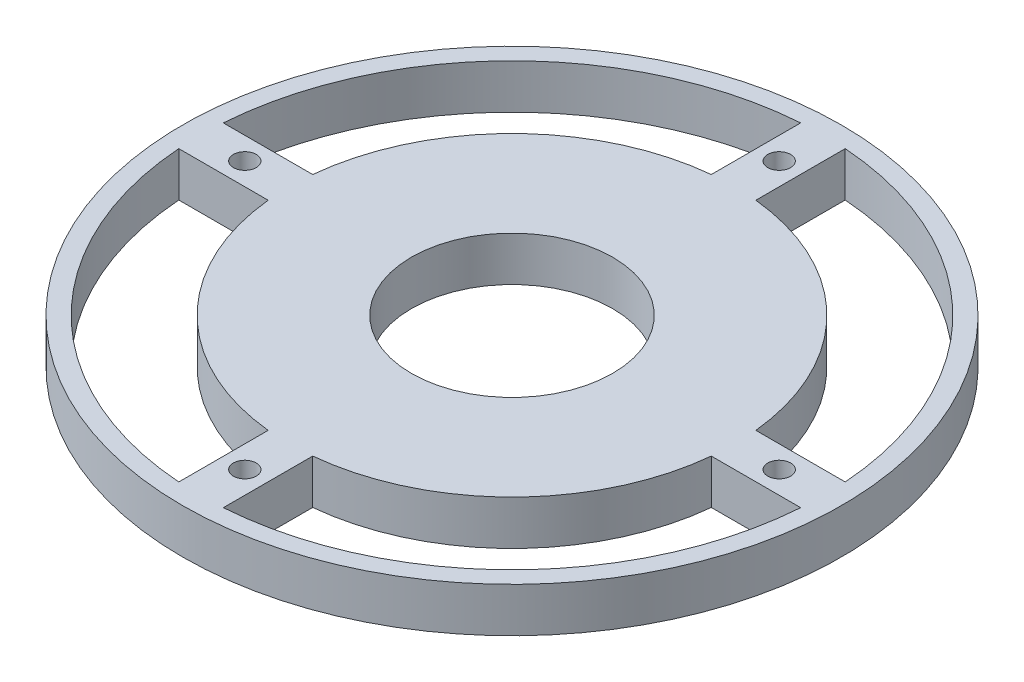
ISO-10303-21;
HEADER;
FILE_DESCRIPTION(('STEP AP214'),'2;1');
FILE_NAME('part.step','',(''),(''),'','','');
FILE_SCHEMA(('AUTOMOTIVE_DESIGN { 1 0 10303 214 1 1 1 1 }'));
ENDSEC;
DATA;
#1=APPLICATION_CONTEXT('core data for automotive mechanical design processes');
#2=APPLICATION_PROTOCOL_DEFINITION('international standard','automotive_design',2000,#1);
#3=PRODUCT_CONTEXT('',#1,'mechanical');
#4=PRODUCT('Part','Part','',(#3));
#5=PRODUCT_RELATED_PRODUCT_CATEGORY('part','',(#4));
#6=PRODUCT_DEFINITION_FORMATION('','',#4);
#7=PRODUCT_DEFINITION_CONTEXT('part definition',#1,'design');
#8=PRODUCT_DEFINITION('design','',#6,#7);
#9=PRODUCT_DEFINITION_SHAPE('','',#8);
#10=(LENGTH_UNIT() NAMED_UNIT(*) SI_UNIT(.MILLI.,.METRE.));
#11=(NAMED_UNIT(*) PLANE_ANGLE_UNIT() SI_UNIT($,.RADIAN.));
#12=(NAMED_UNIT(*) SI_UNIT($,.STERADIAN.) SOLID_ANGLE_UNIT());
#13=UNCERTAINTY_MEASURE_WITH_UNIT(LENGTH_MEASURE(1.E-05),#10,'distance_accuracy_value','');
#14=(GEOMETRIC_REPRESENTATION_CONTEXT(3) GLOBAL_UNCERTAINTY_ASSIGNED_CONTEXT((#13)) GLOBAL_UNIT_ASSIGNED_CONTEXT((#10,
#11,#12)) REPRESENTATION_CONTEXT('',''));
#15=CARTESIAN_POINT('',(0.,0.,0.));
#16=DIRECTION('',(0.,0.,1.));
#17=DIRECTION('',(1.,0.,0.));
#18=AXIS2_PLACEMENT_3D('',#15,#16,#17);
#19=CARTESIAN_POINT('',(0.,6.35,0.));
#20=DIRECTION('',(0.,1.,0.));
#21=DIRECTION('',(0.,0.,1.));
#22=AXIS2_PLACEMENT_3D('',#19,#20,#21);
#23=PLANE('',#22);
#24=CARTESIAN_POINT('',(38.1,6.35,-3.9907631702977E-13));
#25=DIRECTION('',(0.,1.,0.));
#26=DIRECTION('',(0.,0.,1.));
#27=AXIS2_PLACEMENT_3D('',#24,#25,#26);
#28=CIRCLE('',#27,1.63194999999999);
#29=CARTESIAN_POINT('',(38.1,6.35,1.63194999999959));
#30=VERTEX_POINT('',#29);
#31=EDGE_CURVE('E307',#30,#30,#28,.T.);
#32=ORIENTED_EDGE('',*,*,#31,.F.);
#33=EDGE_LOOP('',(#32));
#34=FACE_BOUND('',#33,.T.);
#35=CARTESIAN_POINT('',(0.,6.35,38.1));
#36=DIRECTION('',(0.,1.,0.));
#37=DIRECTION('',(0.,0.,1.));
#38=AXIS2_PLACEMENT_3D('',#35,#36,#37);
#39=CIRCLE('',#38,1.63194999999999);
#40=CARTESIAN_POINT('',(0.,6.35,39.73195));
#41=VERTEX_POINT('',#40);
#42=EDGE_CURVE('E298',#41,#41,#39,.T.);
#43=ORIENTED_EDGE('',*,*,#42,.F.);
#44=EDGE_LOOP('',(#43));
#45=FACE_BOUND('',#44,.T.);
#46=CARTESIAN_POINT('',(-38.1,6.35,1.33025439009923E-13));
#47=DIRECTION('',(0.,1.,0.));
#48=DIRECTION('',(0.,0.,1.));
#49=AXIS2_PLACEMENT_3D('',#46,#47,#48);
#50=CIRCLE('',#49,1.63194999999999);
#51=CARTESIAN_POINT('',(-38.1,6.35,1.63195000000012));
#52=VERTEX_POINT('',#51);
#53=EDGE_CURVE('E295',#52,#52,#50,.T.);
#54=ORIENTED_EDGE('',*,*,#53,.F.);
#55=EDGE_LOOP('',(#54));
#56=FACE_BOUND('',#55,.T.);
#57=CARTESIAN_POINT('',(0.,6.35,-38.1));
#58=DIRECTION('',(0.,1.,0.));
#59=DIRECTION('',(0.,0.,1.));
#60=AXIS2_PLACEMENT_3D('',#57,#58,#59);
#61=CIRCLE('',#60,1.63194999999999);
#62=CARTESIAN_POINT('',(0.,6.35,-36.46805));
#63=VERTEX_POINT('',#62);
#64=EDGE_CURVE('E172',#63,#63,#61,.T.);
#65=ORIENTED_EDGE('',*,*,#64,.F.);
#66=EDGE_LOOP('',(#65));
#67=FACE_BOUND('',#66,.T.);
#68=DIRECTION('',(0.,0.,1.));
#69=VECTOR('',#68,1.);
#70=CARTESIAN_POINT('',(3.175,6.35,0.));
#71=LINE('',#70,#69);
#72=CARTESIAN_POINT('',(3.175,6.35,31.5908511281352));
#73=VERTEX_POINT('',#72);
#74=CARTESIAN_POINT('',(3.17500000000001,6.35,44.3364621389664));
#75=VERTEX_POINT('',#74);
#76=EDGE_CURVE('E203',#73,#75,#71,.T.);
#77=ORIENTED_EDGE('',*,*,#76,.F.);
#78=CARTESIAN_POINT('',(0.,6.35,0.));
#79=DIRECTION('',(0.,1.,0.));
#80=DIRECTION('',(0.,0.,1.));
#81=AXIS2_PLACEMENT_3D('',#78,#79,#80);
#82=CIRCLE('',#81,31.75);
#83=CARTESIAN_POINT('',(31.5908511281352,6.35,3.175));
#84=VERTEX_POINT('',#83);
#85=EDGE_CURVE('E185',#73,#84,#82,.T.);
#86=ORIENTED_EDGE('',*,*,#85,.T.);
#87=DIRECTION('',(1.,0.,0.));
#88=VECTOR('',#87,1.);
#89=CARTESIAN_POINT('',(0.,6.35,3.175));
#90=LINE('',#89,#88);
#91=CARTESIAN_POINT('',(44.3364621389664,6.35,3.175));
#92=VERTEX_POINT('',#91);
#93=EDGE_CURVE('E192',#84,#92,#90,.T.);
#94=ORIENTED_EDGE('',*,*,#93,.T.);
#95=CARTESIAN_POINT('',(0.,6.35,0.));
#96=DIRECTION('',(0.,1.,0.));
#97=DIRECTION('',(0.,0.,1.));
#98=AXIS2_PLACEMENT_3D('',#95,#96,#97);
#99=CIRCLE('',#98,44.45);
#100=EDGE_CURVE('E206',#75,#92,#99,.T.);
#101=ORIENTED_EDGE('',*,*,#100,.F.);
#102=EDGE_LOOP('',(#77,#86,#94,#101));
#103=FACE_BOUND('',#102,.T.);
#104=DIRECTION('',(1.,0.,0.));
#105=VECTOR('',#104,1.);
#106=CARTESIAN_POINT('',(0.,6.35,-3.175));
#107=LINE('',#106,#105);
#108=CARTESIAN_POINT('',(31.5908511281352,6.35,-3.175));
#109=VERTEX_POINT('',#108);
#110=CARTESIAN_POINT('',(44.3364621389664,6.35,-3.175));
#111=VERTEX_POINT('',#110);
#112=EDGE_CURVE('E267',#109,#111,#107,.T.);
#113=ORIENTED_EDGE('',*,*,#112,.F.);
#114=CARTESIAN_POINT('',(0.,6.35,0.));
#115=DIRECTION('',(0.,1.,0.));
#116=DIRECTION('',(0.,0.,1.));
#117=AXIS2_PLACEMENT_3D('',#114,#115,#116);
#118=CIRCLE('',#117,31.75);
#119=CARTESIAN_POINT('',(3.175,6.35,-31.5908511281352));
#120=VERTEX_POINT('',#119);
#121=EDGE_CURVE('E245',#109,#120,#118,.T.);
#122=ORIENTED_EDGE('',*,*,#121,.T.);
#123=DIRECTION('',(0.,0.,1.));
#124=VECTOR('',#123,1.);
#125=CARTESIAN_POINT('',(3.175,6.35,0.));
#126=LINE('',#125,#124);
#127=CARTESIAN_POINT('',(3.17499999999999,6.35,-44.3364621389664));
#128=VERTEX_POINT('',#127);
#129=EDGE_CURVE('E255',#128,#120,#126,.T.);
#130=ORIENTED_EDGE('',*,*,#129,.F.);
#131=CARTESIAN_POINT('',(0.,6.35,0.));
#132=DIRECTION('',(0.,1.,0.));
#133=DIRECTION('',(0.,0.,1.));
#134=AXIS2_PLACEMENT_3D('',#131,#132,#133);
#135=CIRCLE('',#134,44.45);
#136=EDGE_CURVE('E270',#111,#128,#135,.T.);
#137=ORIENTED_EDGE('',*,*,#136,.F.);
#138=EDGE_LOOP('',(#113,#122,#130,#137));
#139=FACE_BOUND('',#138,.T.);
#140=CARTESIAN_POINT('',(0.,6.35,0.));
#141=DIRECTION('',(0.,1.,0.));
#142=DIRECTION('',(0.,0.,1.));
#143=AXIS2_PLACEMENT_3D('',#140,#141,#142);
#144=CIRCLE('',#143,14.351);
#145=CARTESIAN_POINT('',(0.,6.35,14.351));
#146=VERTEX_POINT('',#145);
#147=EDGE_CURVE('E277',#146,#146,#144,.T.);
#148=ORIENTED_EDGE('',*,*,#147,.F.);
#149=EDGE_LOOP('',(#148));
#150=FACE_BOUND('',#149,.T.);
#151=CARTESIAN_POINT('',(0.,6.35,0.));
#152=DIRECTION('',(0.,1.,0.));
#153=DIRECTION('',(0.,0.,1.));
#154=AXIS2_PLACEMENT_3D('',#151,#152,#153);
#155=CIRCLE('',#154,46.99);
#156=CARTESIAN_POINT('',(0.,6.35,46.99));
#157=VERTEX_POINT('',#156);
#158=EDGE_CURVE('E11',#157,#157,#155,.T.);
#159=ORIENTED_EDGE('',*,*,#158,.T.);
#160=EDGE_LOOP('',(#159));
#161=FACE_BOUND('',#160,.T.);
#162=DIRECTION('',(0.,0.,1.));
#163=VECTOR('',#162,1.);
#164=CARTESIAN_POINT('',(-3.175,6.35,0.));
#165=LINE('',#164,#163);
#166=CARTESIAN_POINT('',(-3.17500000000001,6.35,-44.3364621389664));
#167=VERTEX_POINT('',#166);
#168=CARTESIAN_POINT('',(-3.175,6.35,-31.5908511281352));
#169=VERTEX_POINT('',#168);
#170=EDGE_CURVE('E235',#167,#169,#165,.T.);
#171=ORIENTED_EDGE('',*,*,#170,.T.);
#172=CARTESIAN_POINT('',(0.,6.35,0.));
#173=DIRECTION('',(0.,1.,0.));
#174=DIRECTION('',(0.,0.,1.));
#175=AXIS2_PLACEMENT_3D('',#172,#173,#174);
#176=CIRCLE('',#175,31.75);
#177=CARTESIAN_POINT('',(-31.5908511281352,6.35,-3.175));
#178=VERTEX_POINT('',#177);
#179=EDGE_CURVE('E214',#169,#178,#176,.T.);
#180=ORIENTED_EDGE('',*,*,#179,.T.);
#181=DIRECTION('',(1.,0.,0.));
#182=VECTOR('',#181,1.);
#183=CARTESIAN_POINT('',(0.,6.35,-3.175));
#184=LINE('',#183,#182);
#185=CARTESIAN_POINT('',(-44.3364621389664,6.35,-3.175));
#186=VERTEX_POINT('',#185);
#187=EDGE_CURVE('E224',#186,#178,#184,.T.);
#188=ORIENTED_EDGE('',*,*,#187,.F.);
#189=CARTESIAN_POINT('',(0.,6.35,0.));
#190=DIRECTION('',(0.,1.,0.));
#191=DIRECTION('',(0.,0.,1.));
#192=AXIS2_PLACEMENT_3D('',#189,#190,#191);
#193=CIRCLE('',#192,44.45);
#194=EDGE_CURVE('E238',#167,#186,#193,.T.);
#195=ORIENTED_EDGE('',*,*,#194,.F.);
#196=EDGE_LOOP('',(#171,#180,#188,#195));
#197=FACE_BOUND('',#196,.T.);
#198=DIRECTION('',(1.,0.,0.));
#199=VECTOR('',#198,1.);
#200=CARTESIAN_POINT('',(0.,6.35,3.175));
#201=LINE('',#200,#199);
#202=CARTESIAN_POINT('',(-44.3364621389664,6.35,3.175));
#203=VERTEX_POINT('',#202);
#204=CARTESIAN_POINT('',(-31.5908511281352,6.35,3.175));
#205=VERTEX_POINT('',#204);
#206=EDGE_CURVE('E178',#203,#205,#201,.T.);
#207=ORIENTED_EDGE('',*,*,#206,.T.);
#208=CARTESIAN_POINT('',(0.,6.35,0.));
#209=DIRECTION('',(0.,1.,0.));
#210=DIRECTION('',(0.,0.,1.));
#211=AXIS2_PLACEMENT_3D('',#208,#209,#210);
#212=CIRCLE('',#211,31.75);
#213=CARTESIAN_POINT('',(-3.175,6.35,31.5908511281352));
#214=VERTEX_POINT('',#213);
#215=EDGE_CURVE('E50',#205,#214,#212,.T.);
#216=ORIENTED_EDGE('',*,*,#215,.T.);
#217=DIRECTION('',(0.,0.,1.));
#218=VECTOR('',#217,1.);
#219=CARTESIAN_POINT('',(-3.175,6.35,0.));
#220=LINE('',#219,#218);
#221=CARTESIAN_POINT('',(-3.17499999999999,6.35,44.3364621389664));
#222=VERTEX_POINT('',#221);
#223=EDGE_CURVE('E166',#214,#222,#220,.T.);
#224=ORIENTED_EDGE('',*,*,#223,.T.);
#225=CARTESIAN_POINT('',(0.,6.35,0.));
#226=DIRECTION('',(0.,1.,0.));
#227=DIRECTION('',(0.,0.,1.));
#228=AXIS2_PLACEMENT_3D('',#225,#226,#227);
#229=CIRCLE('',#228,44.45);
#230=EDGE_CURVE('E169',#203,#222,#229,.T.);
#231=ORIENTED_EDGE('',*,*,#230,.F.);
#232=EDGE_LOOP('',(#207,#216,#224,#231));
#233=FACE_BOUND('',#232,.T.);
#234=ADVANCED_FACE('F33',(#34,#45,#56,#67,#103,#139,#150,#161,#197,#233),#23,.T.);
#235=CARTESIAN_POINT('',(0.,0.,0.));
#236=DIRECTION('',(0.,1.,0.));
#237=DIRECTION('',(0.,0.,1.));
#238=AXIS2_PLACEMENT_3D('',#235,#236,#237);
#239=PLANE('',#238);
#240=CARTESIAN_POINT('',(38.1,0.,-3.9907631702977E-13));
#241=DIRECTION('',(0.,1.,0.));
#242=DIRECTION('',(0.,0.,1.));
#243=AXIS2_PLACEMENT_3D('',#240,#241,#242);
#244=CIRCLE('',#243,1.63194999999999);
#245=CARTESIAN_POINT('',(38.1,0.,1.63194999999959));
#246=VERTEX_POINT('',#245);
#247=EDGE_CURVE('E37',#246,#246,#244,.T.);
#248=ORIENTED_EDGE('',*,*,#247,.T.);
#249=EDGE_LOOP('',(#248));
#250=FACE_BOUND('',#249,.T.);
#251=CARTESIAN_POINT('',(0.,0.,38.1));
#252=DIRECTION('',(0.,1.,0.));
#253=DIRECTION('',(0.,0.,1.));
#254=AXIS2_PLACEMENT_3D('',#251,#252,#253);
#255=CIRCLE('',#254,1.63194999999999);
#256=CARTESIAN_POINT('',(0.,0.,39.73195));
#257=VERTEX_POINT('',#256);
#258=EDGE_CURVE('E296',#257,#257,#255,.T.);
#259=ORIENTED_EDGE('',*,*,#258,.T.);
#260=EDGE_LOOP('',(#259));
#261=FACE_BOUND('',#260,.T.);
#262=CARTESIAN_POINT('',(-38.1,0.,1.33025439009923E-13));
#263=DIRECTION('',(0.,1.,0.));
#264=DIRECTION('',(0.,0.,1.));
#265=AXIS2_PLACEMENT_3D('',#262,#263,#264);
#266=CIRCLE('',#265,1.63194999999999);
#267=CARTESIAN_POINT('',(-38.1,0.,1.63195000000012));
#268=VERTEX_POINT('',#267);
#269=EDGE_CURVE('E293',#268,#268,#266,.T.);
#270=ORIENTED_EDGE('',*,*,#269,.T.);
#271=EDGE_LOOP('',(#270));
#272=FACE_BOUND('',#271,.T.);
#273=CARTESIAN_POINT('',(0.,0.,-38.1));
#274=DIRECTION('',(0.,1.,0.));
#275=DIRECTION('',(0.,0.,1.));
#276=AXIS2_PLACEMENT_3D('',#273,#274,#275);
#277=CIRCLE('',#276,1.63194999999999);
#278=CARTESIAN_POINT('',(0.,0.,-36.46805));
#279=VERTEX_POINT('',#278);
#280=EDGE_CURVE('E179',#279,#279,#277,.T.);
#281=ORIENTED_EDGE('',*,*,#280,.T.);
#282=EDGE_LOOP('',(#281));
#283=FACE_BOUND('',#282,.T.);
#284=CARTESIAN_POINT('',(0.,0.,0.));
#285=DIRECTION('',(0.,1.,0.));
#286=DIRECTION('',(0.,0.,1.));
#287=AXIS2_PLACEMENT_3D('',#284,#285,#286);
#288=CIRCLE('',#287,31.75);
#289=CARTESIAN_POINT('',(3.175,0.,31.5908511281352));
#290=VERTEX_POINT('',#289);
#291=CARTESIAN_POINT('',(31.5908511281352,0.,3.175));
#292=VERTEX_POINT('',#291);
#293=EDGE_CURVE('E189',#290,#292,#288,.T.);
#294=ORIENTED_EDGE('',*,*,#293,.F.);
#295=DIRECTION('',(0.,0.,1.));
#296=VECTOR('',#295,1.);
#297=CARTESIAN_POINT('',(3.175,0.,0.));
#298=LINE('',#297,#296);
#299=CARTESIAN_POINT('',(3.17500000000001,0.,44.3364621389664));
#300=VERTEX_POINT('',#299);
#301=EDGE_CURVE('E191',#290,#300,#298,.T.);
#302=ORIENTED_EDGE('',*,*,#301,.T.);
#303=CARTESIAN_POINT('',(0.,0.,0.));
#304=DIRECTION('',(0.,1.,0.));
#305=DIRECTION('',(0.,0.,1.));
#306=AXIS2_PLACEMENT_3D('',#303,#304,#305);
#307=CIRCLE('',#306,44.45);
#308=CARTESIAN_POINT('',(44.3364621389664,0.,3.175));
#309=VERTEX_POINT('',#308);
#310=EDGE_CURVE('E195',#300,#309,#307,.T.);
#311=ORIENTED_EDGE('',*,*,#310,.T.);
#312=DIRECTION('',(1.,0.,0.));
#313=VECTOR('',#312,1.);
#314=CARTESIAN_POINT('',(0.,0.,3.175));
#315=LINE('',#314,#313);
#316=EDGE_CURVE('E198',#292,#309,#315,.T.);
#317=ORIENTED_EDGE('',*,*,#316,.F.);
#318=EDGE_LOOP('',(#294,#302,#311,#317));
#319=FACE_BOUND('',#318,.T.);
#320=CARTESIAN_POINT('',(0.,0.,0.));
#321=DIRECTION('',(0.,1.,0.));
#322=DIRECTION('',(0.,0.,1.));
#323=AXIS2_PLACEMENT_3D('',#320,#321,#322);
#324=CIRCLE('',#323,31.75);
#325=CARTESIAN_POINT('',(31.5908511281352,0.,-3.175));
#326=VERTEX_POINT('',#325);
#327=CARTESIAN_POINT('',(3.175,0.,-31.5908511281352));
#328=VERTEX_POINT('',#327);
#329=EDGE_CURVE('E252',#326,#328,#324,.T.);
#330=ORIENTED_EDGE('',*,*,#329,.F.);
#331=DIRECTION('',(1.,0.,0.));
#332=VECTOR('',#331,1.);
#333=CARTESIAN_POINT('',(0.,0.,-3.175));
#334=LINE('',#333,#332);
#335=CARTESIAN_POINT('',(44.3364621389664,0.,-3.175));
#336=VERTEX_POINT('',#335);
#337=EDGE_CURVE('E254',#326,#336,#334,.T.);
#338=ORIENTED_EDGE('',*,*,#337,.T.);
#339=CARTESIAN_POINT('',(0.,0.,0.));
#340=DIRECTION('',(0.,1.,0.));
#341=DIRECTION('',(0.,0.,1.));
#342=AXIS2_PLACEMENT_3D('',#339,#340,#341);
#343=CIRCLE('',#342,44.45);
#344=CARTESIAN_POINT('',(3.17499999999999,0.,-44.3364621389664));
#345=VERTEX_POINT('',#344);
#346=EDGE_CURVE('E258',#336,#345,#343,.T.);
#347=ORIENTED_EDGE('',*,*,#346,.T.);
#348=DIRECTION('',(0.,0.,1.));
#349=VECTOR('',#348,1.);
#350=CARTESIAN_POINT('',(3.175,0.,0.));
#351=LINE('',#350,#349);
#352=EDGE_CURVE('E261',#345,#328,#351,.T.);
#353=ORIENTED_EDGE('',*,*,#352,.T.);
#354=EDGE_LOOP('',(#330,#338,#347,#353));
#355=FACE_BOUND('',#354,.T.);
#356=CARTESIAN_POINT('',(0.,0.,0.));
#357=DIRECTION('',(0.,1.,0.));
#358=DIRECTION('',(0.,0.,1.));
#359=AXIS2_PLACEMENT_3D('',#356,#357,#358);
#360=CIRCLE('',#359,14.351);
#361=CARTESIAN_POINT('',(0.,0.,14.351));
#362=VERTEX_POINT('',#361);
#363=EDGE_CURVE('E284',#362,#362,#360,.T.);
#364=ORIENTED_EDGE('',*,*,#363,.T.);
#365=EDGE_LOOP('',(#364));
#366=FACE_BOUND('',#365,.T.);
#367=CARTESIAN_POINT('',(0.,0.,0.));
#368=DIRECTION('',(0.,1.,0.));
#369=DIRECTION('',(0.,0.,1.));
#370=AXIS2_PLACEMENT_3D('',#367,#368,#369);
#371=CIRCLE('',#370,46.99);
#372=CARTESIAN_POINT('',(0.,0.,46.99));
#373=VERTEX_POINT('',#372);
#374=EDGE_CURVE('E42',#373,#373,#371,.T.);
#375=ORIENTED_EDGE('',*,*,#374,.F.);
#376=EDGE_LOOP('',(#375));
#377=FACE_BOUND('',#376,.T.);
#378=CARTESIAN_POINT('',(0.,0.,0.));
#379=DIRECTION('',(0.,1.,0.));
#380=DIRECTION('',(0.,0.,1.));
#381=AXIS2_PLACEMENT_3D('',#378,#379,#380);
#382=CIRCLE('',#381,31.75);
#383=CARTESIAN_POINT('',(-3.175,0.,-31.5908511281352));
#384=VERTEX_POINT('',#383);
#385=CARTESIAN_POINT('',(-31.5908511281352,0.,-3.175));
#386=VERTEX_POINT('',#385);
#387=EDGE_CURVE('E221',#384,#386,#382,.T.);
#388=ORIENTED_EDGE('',*,*,#387,.F.);
#389=DIRECTION('',(0.,0.,1.));
#390=VECTOR('',#389,1.);
#391=CARTESIAN_POINT('',(-3.175,0.,0.));
#392=LINE('',#391,#390);
#393=CARTESIAN_POINT('',(-3.17500000000001,0.,-44.3364621389664));
#394=VERTEX_POINT('',#393);
#395=EDGE_CURVE('E223',#394,#384,#392,.T.);
#396=ORIENTED_EDGE('',*,*,#395,.F.);
#397=CARTESIAN_POINT('',(0.,0.,0.));
#398=DIRECTION('',(0.,1.,0.));
#399=DIRECTION('',(0.,0.,1.));
#400=AXIS2_PLACEMENT_3D('',#397,#398,#399);
#401=CIRCLE('',#400,44.45);
#402=CARTESIAN_POINT('',(-44.3364621389664,0.,-3.175));
#403=VERTEX_POINT('',#402);
#404=EDGE_CURVE('E226',#394,#403,#401,.T.);
#405=ORIENTED_EDGE('',*,*,#404,.T.);
#406=DIRECTION('',(1.,0.,0.));
#407=VECTOR('',#406,1.);
#408=CARTESIAN_POINT('',(0.,0.,-3.175));
#409=LINE('',#408,#407);
#410=EDGE_CURVE('E229',#403,#386,#409,.T.);
#411=ORIENTED_EDGE('',*,*,#410,.T.);
#412=EDGE_LOOP('',(#388,#396,#405,#411));
#413=FACE_BOUND('',#412,.T.);
#414=CARTESIAN_POINT('',(0.,0.,0.));
#415=DIRECTION('',(0.,1.,0.));
#416=DIRECTION('',(0.,0.,1.));
#417=AXIS2_PLACEMENT_3D('',#414,#415,#416);
#418=CIRCLE('',#417,31.75);
#419=CARTESIAN_POINT('',(-31.5908511281352,0.,3.175));
#420=VERTEX_POINT('',#419);
#421=CARTESIAN_POINT('',(-3.175,0.,31.5908511281352));
#422=VERTEX_POINT('',#421);
#423=EDGE_CURVE('E158',#420,#422,#418,.T.);
#424=ORIENTED_EDGE('',*,*,#423,.F.);
#425=DIRECTION('',(1.,0.,0.));
#426=VECTOR('',#425,1.);
#427=CARTESIAN_POINT('',(0.,0.,3.175));
#428=LINE('',#427,#426);
#429=CARTESIAN_POINT('',(-44.3364621389664,0.,3.175));
#430=VERTEX_POINT('',#429);
#431=EDGE_CURVE('E150',#430,#420,#428,.T.);
#432=ORIENTED_EDGE('',*,*,#431,.F.);
#433=CARTESIAN_POINT('',(0.,0.,0.));
#434=DIRECTION('',(0.,1.,0.));
#435=DIRECTION('',(0.,0.,1.));
#436=AXIS2_PLACEMENT_3D('',#433,#434,#435);
#437=CIRCLE('',#436,44.45);
#438=CARTESIAN_POINT('',(-3.17499999999999,0.,44.3364621389664));
#439=VERTEX_POINT('',#438);
#440=EDGE_CURVE('E58',#430,#439,#437,.T.);
#441=ORIENTED_EDGE('',*,*,#440,.T.);
#442=DIRECTION('',(0.,0.,1.));
#443=VECTOR('',#442,1.);
#444=CARTESIAN_POINT('',(-3.175,0.,0.));
#445=LINE('',#444,#443);
#446=EDGE_CURVE('E162',#422,#439,#445,.T.);
#447=ORIENTED_EDGE('',*,*,#446,.F.);
#448=EDGE_LOOP('',(#424,#432,#441,#447));
#449=FACE_BOUND('',#448,.T.);
#450=ADVANCED_FACE('F165',(#250,#261,#272,#283,#319,#355,#366,#377,#413,#449),#239,.F.);
#451=CARTESIAN_POINT('',(0.,6.35,0.));
#452=DIRECTION('',(0.,-1.,0.));
#453=DIRECTION('',(0.,0.,-1.));
#454=AXIS2_PLACEMENT_3D('',#451,#452,#453);
#455=CYLINDRICAL_SURFACE('',#454,46.99);
#456=ORIENTED_EDGE('',*,*,#158,.F.);
#457=EDGE_LOOP('',(#456));
#458=FACE_BOUND('',#457,.T.);
#459=ORIENTED_EDGE('',*,*,#374,.T.);
#460=EDGE_LOOP('',(#459));
#461=FACE_BOUND('',#460,.T.);
#462=ADVANCED_FACE('F35',(#458,#461),#455,.T.);
#463=CARTESIAN_POINT('',(0.,0.,0.));
#464=DIRECTION('',(0.,1.,0.));
#465=DIRECTION('',(0.,0.,1.));
#466=AXIS2_PLACEMENT_3D('',#463,#464,#465);
#467=CYLINDRICAL_SURFACE('',#466,14.351);
#468=ORIENTED_EDGE('',*,*,#363,.F.);
#469=EDGE_LOOP('',(#468));
#470=FACE_BOUND('',#469,.T.);
#471=ORIENTED_EDGE('',*,*,#147,.T.);
#472=EDGE_LOOP('',(#471));
#473=FACE_BOUND('',#472,.T.);
#474=ADVANCED_FACE('F402',(#470,#473),#467,.F.);
#475=CARTESIAN_POINT('',(0.,0.,0.));
#476=DIRECTION('',(0.,1.,0.));
#477=DIRECTION('',(0.,0.,1.));
#478=AXIS2_PLACEMENT_3D('',#475,#476,#477);
#479=CYLINDRICAL_SURFACE('',#478,31.75);
#480=ORIENTED_EDGE('',*,*,#121,.F.);
#481=DIRECTION('',(0.,1.,0.));
#482=VECTOR('',#481,1.);
#483=CARTESIAN_POINT('',(31.5908511281352,0.,-3.175));
#484=LINE('',#483,#482);
#485=EDGE_CURVE('E264',#326,#109,#484,.T.);
#486=ORIENTED_EDGE('',*,*,#485,.F.);
#487=ORIENTED_EDGE('',*,*,#329,.T.);
#488=DIRECTION('',(0.,1.,0.));
#489=VECTOR('',#488,1.);
#490=CARTESIAN_POINT('',(3.175,0.,-31.5908511281352));
#491=LINE('',#490,#489);
#492=EDGE_CURVE('E275',#328,#120,#491,.T.);
#493=ORIENTED_EDGE('',*,*,#492,.T.);
#494=EDGE_LOOP('',(#480,#486,#487,#493));
#495=FACE_BOUND('',#494,.T.);
#496=ADVANCED_FACE('F392',(#495),#479,.T.);
#497=CARTESIAN_POINT('',(3.175,0.,0.));
#498=DIRECTION('',(-1.,0.,0.));
#499=DIRECTION('',(0.,0.,1.));
#500=AXIS2_PLACEMENT_3D('',#497,#498,#499);
#501=PLANE('',#500);
#502=ORIENTED_EDGE('',*,*,#129,.T.);
#503=ORIENTED_EDGE('',*,*,#492,.F.);
#504=ORIENTED_EDGE('',*,*,#352,.F.);
#505=DIRECTION('',(0.,1.,0.));
#506=VECTOR('',#505,1.);
#507=CARTESIAN_POINT('',(3.17499999999999,0.,-44.3364621389664));
#508=LINE('',#507,#506);
#509=EDGE_CURVE('E278',#345,#128,#508,.T.);
#510=ORIENTED_EDGE('',*,*,#509,.T.);
#511=EDGE_LOOP('',(#502,#503,#504,#510));
#512=FACE_BOUND('',#511,.T.);
#513=ADVANCED_FACE('F388',(#512),#501,.F.);
#514=CARTESIAN_POINT('',(0.,0.,0.));
#515=DIRECTION('',(0.,1.,0.));
#516=DIRECTION('',(0.,0.,1.));
#517=AXIS2_PLACEMENT_3D('',#514,#515,#516);
#518=CYLINDRICAL_SURFACE('',#517,44.45);
#519=ORIENTED_EDGE('',*,*,#136,.T.);
#520=ORIENTED_EDGE('',*,*,#509,.F.);
#521=ORIENTED_EDGE('',*,*,#346,.F.);
#522=DIRECTION('',(0.,1.,0.));
#523=VECTOR('',#522,1.);
#524=CARTESIAN_POINT('',(44.3364621389664,0.,-3.175));
#525=LINE('',#524,#523);
#526=EDGE_CURVE('E280',#336,#111,#525,.T.);
#527=ORIENTED_EDGE('',*,*,#526,.T.);
#528=EDGE_LOOP('',(#519,#520,#521,#527));
#529=FACE_BOUND('',#528,.T.);
#530=ADVANCED_FACE('F391',(#529),#518,.F.);
#531=CARTESIAN_POINT('',(0.,0.,-3.175));
#532=DIRECTION('',(0.,0.,1.));
#533=DIRECTION('',(1.,0.,0.));
#534=AXIS2_PLACEMENT_3D('',#531,#532,#533);
#535=PLANE('',#534);
#536=ORIENTED_EDGE('',*,*,#112,.T.);
#537=ORIENTED_EDGE('',*,*,#526,.F.);
#538=ORIENTED_EDGE('',*,*,#337,.F.);
#539=ORIENTED_EDGE('',*,*,#485,.T.);
#540=EDGE_LOOP('',(#536,#537,#538,#539));
#541=FACE_BOUND('',#540,.T.);
#542=ADVANCED_FACE('F386',(#541),#535,.F.);
#543=CARTESIAN_POINT('',(0.,0.,0.));
#544=DIRECTION('',(0.,1.,0.));
#545=DIRECTION('',(0.,0.,1.));
#546=AXIS2_PLACEMENT_3D('',#543,#544,#545);
#547=CYLINDRICAL_SURFACE('',#546,31.75);
#548=ORIENTED_EDGE('',*,*,#179,.F.);
#549=DIRECTION('',(0.,1.,0.));
#550=VECTOR('',#549,1.);
#551=CARTESIAN_POINT('',(-3.175,0.,-31.5908511281352));
#552=LINE('',#551,#550);
#553=EDGE_CURVE('E232',#384,#169,#552,.T.);
#554=ORIENTED_EDGE('',*,*,#553,.F.);
#555=ORIENTED_EDGE('',*,*,#387,.T.);
#556=DIRECTION('',(0.,1.,0.));
#557=VECTOR('',#556,1.);
#558=CARTESIAN_POINT('',(-31.5908511281352,0.,-3.175));
#559=LINE('',#558,#557);
#560=EDGE_CURVE('E243',#386,#178,#559,.T.);
#561=ORIENTED_EDGE('',*,*,#560,.T.);
#562=EDGE_LOOP('',(#548,#554,#555,#561));
#563=FACE_BOUND('',#562,.T.);
#564=ADVANCED_FACE('F376',(#563),#547,.T.);
#565=CARTESIAN_POINT('',(0.,0.,-3.175));
#566=DIRECTION('',(0.,0.,1.));
#567=DIRECTION('',(1.,0.,0.));
#568=AXIS2_PLACEMENT_3D('',#565,#566,#567);
#569=PLANE('',#568);
#570=ORIENTED_EDGE('',*,*,#187,.T.);
#571=ORIENTED_EDGE('',*,*,#560,.F.);
#572=ORIENTED_EDGE('',*,*,#410,.F.);
#573=DIRECTION('',(0.,1.,0.));
#574=VECTOR('',#573,1.);
#575=CARTESIAN_POINT('',(-44.3364621389664,0.,-3.175));
#576=LINE('',#575,#574);
#577=EDGE_CURVE('E246',#403,#186,#576,.T.);
#578=ORIENTED_EDGE('',*,*,#577,.T.);
#579=EDGE_LOOP('',(#570,#571,#572,#578));
#580=FACE_BOUND('',#579,.T.);
#581=ADVANCED_FACE('F372',(#580),#569,.F.);
#582=CARTESIAN_POINT('',(0.,0.,0.));
#583=DIRECTION('',(0.,1.,0.));
#584=DIRECTION('',(0.,0.,1.));
#585=AXIS2_PLACEMENT_3D('',#582,#583,#584);
#586=CYLINDRICAL_SURFACE('',#585,44.45);
#587=ORIENTED_EDGE('',*,*,#194,.T.);
#588=ORIENTED_EDGE('',*,*,#577,.F.);
#589=ORIENTED_EDGE('',*,*,#404,.F.);
#590=DIRECTION('',(0.,1.,0.));
#591=VECTOR('',#590,1.);
#592=CARTESIAN_POINT('',(-3.17500000000001,0.,-44.3364621389664));
#593=LINE('',#592,#591);
#594=EDGE_CURVE('E248',#394,#167,#593,.T.);
#595=ORIENTED_EDGE('',*,*,#594,.T.);
#596=EDGE_LOOP('',(#587,#588,#589,#595));
#597=FACE_BOUND('',#596,.T.);
#598=ADVANCED_FACE('F375',(#597),#586,.F.);
#599=CARTESIAN_POINT('',(-3.175,0.,0.));
#600=DIRECTION('',(-1.,0.,0.));
#601=DIRECTION('',(0.,0.,1.));
#602=AXIS2_PLACEMENT_3D('',#599,#600,#601);
#603=PLANE('',#602);
#604=ORIENTED_EDGE('',*,*,#170,.F.);
#605=ORIENTED_EDGE('',*,*,#594,.F.);
#606=ORIENTED_EDGE('',*,*,#395,.T.);
#607=ORIENTED_EDGE('',*,*,#553,.T.);
#608=EDGE_LOOP('',(#604,#605,#606,#607));
#609=FACE_BOUND('',#608,.T.);
#610=ADVANCED_FACE('F370',(#609),#603,.T.);
#611=CARTESIAN_POINT('',(0.,0.,0.));
#612=DIRECTION('',(0.,1.,0.));
#613=DIRECTION('',(0.,0.,1.));
#614=AXIS2_PLACEMENT_3D('',#611,#612,#613);
#615=CYLINDRICAL_SURFACE('',#614,31.75);
#616=ORIENTED_EDGE('',*,*,#85,.F.);
#617=DIRECTION('',(0.,1.,0.));
#618=VECTOR('',#617,1.);
#619=CARTESIAN_POINT('',(3.175,0.,31.5908511281352));
#620=LINE('',#619,#618);
#621=EDGE_CURVE('E200',#290,#73,#620,.T.);
#622=ORIENTED_EDGE('',*,*,#621,.F.);
#623=ORIENTED_EDGE('',*,*,#293,.T.);
#624=DIRECTION('',(0.,1.,0.));
#625=VECTOR('',#624,1.);
#626=CARTESIAN_POINT('',(31.5908511281352,0.,3.175));
#627=LINE('',#626,#625);
#628=EDGE_CURVE('E211',#292,#84,#627,.T.);
#629=ORIENTED_EDGE('',*,*,#628,.T.);
#630=EDGE_LOOP('',(#616,#622,#623,#629));
#631=FACE_BOUND('',#630,.T.);
#632=ADVANCED_FACE('F360',(#631),#615,.T.);
#633=CARTESIAN_POINT('',(0.,0.,3.175));
#634=DIRECTION('',(0.,0.,1.));
#635=DIRECTION('',(1.,0.,0.));
#636=AXIS2_PLACEMENT_3D('',#633,#634,#635);
#637=PLANE('',#636);
#638=ORIENTED_EDGE('',*,*,#93,.F.);
#639=ORIENTED_EDGE('',*,*,#628,.F.);
#640=ORIENTED_EDGE('',*,*,#316,.T.);
#641=DIRECTION('',(0.,1.,0.));
#642=VECTOR('',#641,1.);
#643=CARTESIAN_POINT('',(44.3364621389664,0.,3.175));
#644=LINE('',#643,#642);
#645=EDGE_CURVE('E215',#309,#92,#644,.T.);
#646=ORIENTED_EDGE('',*,*,#645,.T.);
#647=EDGE_LOOP('',(#638,#639,#640,#646));
#648=FACE_BOUND('',#647,.T.);
#649=ADVANCED_FACE('F356',(#648),#637,.T.);
#650=CARTESIAN_POINT('',(0.,0.,0.));
#651=DIRECTION('',(0.,1.,0.));
#652=DIRECTION('',(0.,0.,1.));
#653=AXIS2_PLACEMENT_3D('',#650,#651,#652);
#654=CYLINDRICAL_SURFACE('',#653,44.45);
#655=ORIENTED_EDGE('',*,*,#100,.T.);
#656=ORIENTED_EDGE('',*,*,#645,.F.);
#657=ORIENTED_EDGE('',*,*,#310,.F.);
#658=DIRECTION('',(0.,1.,0.));
#659=VECTOR('',#658,1.);
#660=CARTESIAN_POINT('',(3.17500000000001,0.,44.3364621389664));
#661=LINE('',#660,#659);
#662=EDGE_CURVE('E217',#300,#75,#661,.T.);
#663=ORIENTED_EDGE('',*,*,#662,.T.);
#664=EDGE_LOOP('',(#655,#656,#657,#663));
#665=FACE_BOUND('',#664,.T.);
#666=ADVANCED_FACE('F359',(#665),#654,.F.);
#667=CARTESIAN_POINT('',(3.175,0.,0.));
#668=DIRECTION('',(-1.,0.,0.));
#669=DIRECTION('',(0.,0.,1.));
#670=AXIS2_PLACEMENT_3D('',#667,#668,#669);
#671=PLANE('',#670);
#672=ORIENTED_EDGE('',*,*,#76,.T.);
#673=ORIENTED_EDGE('',*,*,#662,.F.);
#674=ORIENTED_EDGE('',*,*,#301,.F.);
#675=ORIENTED_EDGE('',*,*,#621,.T.);
#676=EDGE_LOOP('',(#672,#673,#674,#675));
#677=FACE_BOUND('',#676,.T.);
#678=ADVANCED_FACE('F348',(#677),#671,.F.);
#679=CARTESIAN_POINT('',(0.,0.,0.));
#680=DIRECTION('',(0.,1.,0.));
#681=DIRECTION('',(0.,0.,1.));
#682=AXIS2_PLACEMENT_3D('',#679,#680,#681);
#683=CYLINDRICAL_SURFACE('',#682,31.75);
#684=ORIENTED_EDGE('',*,*,#215,.F.);
#685=DIRECTION('',(0.,1.,0.));
#686=VECTOR('',#685,1.);
#687=CARTESIAN_POINT('',(-31.5908511281352,0.,3.175));
#688=LINE('',#687,#686);
#689=EDGE_CURVE('E153',#420,#205,#688,.T.);
#690=ORIENTED_EDGE('',*,*,#689,.F.);
#691=ORIENTED_EDGE('',*,*,#423,.T.);
#692=DIRECTION('',(0.,1.,0.));
#693=VECTOR('',#692,1.);
#694=CARTESIAN_POINT('',(-3.175,0.,31.5908511281352));
#695=LINE('',#694,#693);
#696=EDGE_CURVE('E183',#422,#214,#695,.T.);
#697=ORIENTED_EDGE('',*,*,#696,.T.);
#698=EDGE_LOOP('',(#684,#690,#691,#697));
#699=FACE_BOUND('',#698,.T.);
#700=ADVANCED_FACE('F160',(#699),#683,.T.);
#701=CARTESIAN_POINT('',(-3.175,0.,0.));
#702=DIRECTION('',(-1.,0.,0.));
#703=DIRECTION('',(0.,0.,1.));
#704=AXIS2_PLACEMENT_3D('',#701,#702,#703);
#705=PLANE('',#704);
#706=ORIENTED_EDGE('',*,*,#223,.F.);
#707=ORIENTED_EDGE('',*,*,#696,.F.);
#708=ORIENTED_EDGE('',*,*,#446,.T.);
#709=DIRECTION('',(0.,1.,0.));
#710=VECTOR('',#709,1.);
#711=CARTESIAN_POINT('',(-3.17499999999999,0.,44.3364621389664));
#712=LINE('',#711,#710);
#713=EDGE_CURVE('E186',#439,#222,#712,.T.);
#714=ORIENTED_EDGE('',*,*,#713,.T.);
#715=EDGE_LOOP('',(#706,#707,#708,#714));
#716=FACE_BOUND('',#715,.T.);
#717=ADVANCED_FACE('F340',(#716),#705,.T.);
#718=CARTESIAN_POINT('',(0.,0.,0.));
#719=DIRECTION('',(0.,1.,0.));
#720=DIRECTION('',(0.,0.,1.));
#721=AXIS2_PLACEMENT_3D('',#718,#719,#720);
#722=CYLINDRICAL_SURFACE('',#721,44.45);
#723=ORIENTED_EDGE('',*,*,#230,.T.);
#724=ORIENTED_EDGE('',*,*,#713,.F.);
#725=ORIENTED_EDGE('',*,*,#440,.F.);
#726=DIRECTION('',(0.,1.,0.));
#727=VECTOR('',#726,1.);
#728=CARTESIAN_POINT('',(-44.3364621389664,0.,3.175));
#729=LINE('',#728,#727);
#730=EDGE_CURVE('E155',#430,#203,#729,.T.);
#731=ORIENTED_EDGE('',*,*,#730,.T.);
#732=EDGE_LOOP('',(#723,#724,#725,#731));
#733=FACE_BOUND('',#732,.T.);
#734=ADVANCED_FACE('F338',(#733),#722,.F.);
#735=CARTESIAN_POINT('',(0.,0.,3.175));
#736=DIRECTION('',(0.,0.,1.));
#737=DIRECTION('',(1.,0.,0.));
#738=AXIS2_PLACEMENT_3D('',#735,#736,#737);
#739=PLANE('',#738);
#740=ORIENTED_EDGE('',*,*,#206,.F.);
#741=ORIENTED_EDGE('',*,*,#730,.F.);
#742=ORIENTED_EDGE('',*,*,#431,.T.);
#743=ORIENTED_EDGE('',*,*,#689,.T.);
#744=EDGE_LOOP('',(#740,#741,#742,#743));
#745=FACE_BOUND('',#744,.T.);
#746=ADVANCED_FACE('F152',(#745),#739,.T.);
#747=CARTESIAN_POINT('',(0.,6.35,-38.1));
#748=DIRECTION('',(0.,1.,0.));
#749=DIRECTION('',(0.,0.,1.));
#750=AXIS2_PLACEMENT_3D('',#747,#748,#749);
#751=CYLINDRICAL_SURFACE('',#750,1.63194999999999);
#752=ORIENTED_EDGE('',*,*,#64,.T.);
#753=EDGE_LOOP('',(#752));
#754=FACE_BOUND('',#753,.T.);
#755=ORIENTED_EDGE('',*,*,#280,.F.);
#756=EDGE_LOOP('',(#755));
#757=FACE_BOUND('',#756,.T.);
#758=ADVANCED_FACE('F351',(#754,#757),#751,.F.);
#759=CARTESIAN_POINT('',(-38.1,6.35,1.33025439009923E-13));
#760=DIRECTION('',(0.,1.,0.));
#761=DIRECTION('',(0.,0.,1.));
#762=AXIS2_PLACEMENT_3D('',#759,#760,#761);
#763=CYLINDRICAL_SURFACE('',#762,1.63194999999999);
#764=ORIENTED_EDGE('',*,*,#53,.T.);
#765=EDGE_LOOP('',(#764));
#766=FACE_BOUND('',#765,.T.);
#767=ORIENTED_EDGE('',*,*,#269,.F.);
#768=EDGE_LOOP('',(#767));
#769=FACE_BOUND('',#768,.T.);
#770=ADVANCED_FACE('F447',(#766,#769),#763,.F.);
#771=CARTESIAN_POINT('',(0.,6.35,38.1));
#772=DIRECTION('',(0.,1.,0.));
#773=DIRECTION('',(0.,0.,1.));
#774=AXIS2_PLACEMENT_3D('',#771,#772,#773);
#775=CYLINDRICAL_SURFACE('',#774,1.63194999999999);
#776=ORIENTED_EDGE('',*,*,#42,.T.);
#777=EDGE_LOOP('',(#776));
#778=FACE_BOUND('',#777,.T.);
#779=ORIENTED_EDGE('',*,*,#258,.F.);
#780=EDGE_LOOP('',(#779));
#781=FACE_BOUND('',#780,.T.);
#782=ADVANCED_FACE('F452',(#778,#781),#775,.F.);
#783=CARTESIAN_POINT('',(38.1,6.35,-3.9907631702977E-13));
#784=DIRECTION('',(0.,1.,0.));
#785=DIRECTION('',(0.,0.,1.));
#786=AXIS2_PLACEMENT_3D('',#783,#784,#785);
#787=CYLINDRICAL_SURFACE('',#786,1.63194999999999);
#788=ORIENTED_EDGE('',*,*,#31,.T.);
#789=EDGE_LOOP('',(#788));
#790=FACE_BOUND('',#789,.T.);
#791=ORIENTED_EDGE('',*,*,#247,.F.);
#792=EDGE_LOOP('',(#791));
#793=FACE_BOUND('',#792,.T.);
#794=ADVANCED_FACE('F312',(#790,#793),#787,.F.);
#795=CLOSED_SHELL('',(#234,#450,#462,#474,#496,#513,#530,#542,#564,#581,#598,#610,#632,#649,
#666,#678,#700,#717,#734,#746,#758,#770,#782,#794));
#796=MANIFOLD_SOLID_BREP('B2',#795);
#797=ADVANCED_BREP_SHAPE_REPRESENTATION('',(#18,#796),#14);
#798=SHAPE_DEFINITION_REPRESENTATION(#9,#797);
ENDSEC;
END-ISO-10303-21;
